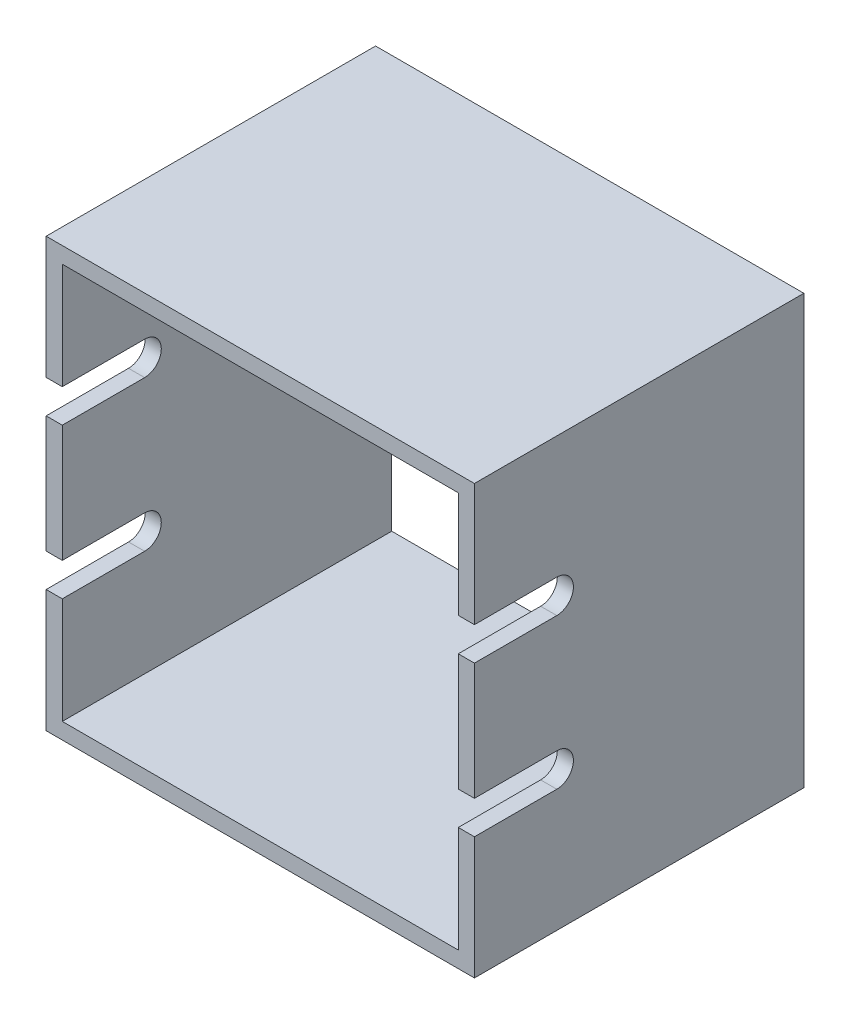
ISO-10303-21;
HEADER;
FILE_DESCRIPTION(('STEP AP214'),'2;1');
FILE_NAME('part.step','',(''),(''),'','','');
FILE_SCHEMA(('AUTOMOTIVE_DESIGN { 1 0 10303 214 1 1 1 1 }'));
ENDSEC;
DATA;
#1=APPLICATION_CONTEXT('core data for automotive mechanical design processes');
#2=APPLICATION_PROTOCOL_DEFINITION('international standard','automotive_design',2000,#1);
#3=PRODUCT_CONTEXT('',#1,'mechanical');
#4=PRODUCT('Part','Part','',(#3));
#5=PRODUCT_RELATED_PRODUCT_CATEGORY('part','',(#4));
#6=PRODUCT_DEFINITION_FORMATION('','',#4);
#7=PRODUCT_DEFINITION_CONTEXT('part definition',#1,'design');
#8=PRODUCT_DEFINITION('design','',#6,#7);
#9=PRODUCT_DEFINITION_SHAPE('','',#8);
#10=(LENGTH_UNIT() NAMED_UNIT(*) SI_UNIT(.MILLI.,.METRE.));
#11=(NAMED_UNIT(*) PLANE_ANGLE_UNIT() SI_UNIT($,.RADIAN.));
#12=(NAMED_UNIT(*) SI_UNIT($,.STERADIAN.) SOLID_ANGLE_UNIT());
#13=UNCERTAINTY_MEASURE_WITH_UNIT(LENGTH_MEASURE(1.E-05),#10,'distance_accuracy_value','');
#14=(GEOMETRIC_REPRESENTATION_CONTEXT(3) GLOBAL_UNCERTAINTY_ASSIGNED_CONTEXT((#13)) GLOBAL_UNIT_ASSIGNED_CONTEXT((#10,
#11,#12)) REPRESENTATION_CONTEXT('',''));
#15=CARTESIAN_POINT('',(0.,0.,0.));
#16=DIRECTION('',(0.,0.,1.));
#17=DIRECTION('',(1.,0.,0.));
#18=AXIS2_PLACEMENT_3D('',#15,#16,#17);
#19=CARTESIAN_POINT('',(-65.,-65.,100.));
#20=DIRECTION('',(1.,0.,0.));
#21=DIRECTION('',(0.,0.,-1.));
#22=AXIS2_PLACEMENT_3D('',#19,#20,#21);
#23=PLANE('',#22);
#24=CARTESIAN_POINT('',(-65.,22.825,75.));
#25=DIRECTION('',(-1.,0.,0.));
#26=DIRECTION('',(0.,0.,1.));
#27=AXIS2_PLACEMENT_3D('',#24,#25,#26);
#28=CIRCLE('',#27,5.05);
#29=CARTESIAN_POINT('',(-65.,27.875,75.));
#30=VERTEX_POINT('',#29);
#31=CARTESIAN_POINT('',(-65.,17.775,75.));
#32=VERTEX_POINT('',#31);
#33=EDGE_CURVE('E206',#30,#32,#28,.T.);
#34=ORIENTED_EDGE('',*,*,#33,.F.);
#35=DIRECTION('',(0.,0.,-1.));
#36=VECTOR('',#35,1.);
#37=CARTESIAN_POINT('',(-65.,27.875,0.));
#38=LINE('',#37,#36);
#39=CARTESIAN_POINT('',(-65.,27.875,100.));
#40=VERTEX_POINT('',#39);
#41=EDGE_CURVE('E214',#40,#30,#38,.T.);
#42=ORIENTED_EDGE('',*,*,#41,.F.);
#43=DIRECTION('',(0.,-1.,0.));
#44=VECTOR('',#43,1.);
#45=CARTESIAN_POINT('',(-65.,-65.,100.));
#46=LINE('',#45,#44);
#47=CARTESIAN_POINT('',(-65.,65.,100.));
#48=VERTEX_POINT('',#47);
#49=EDGE_CURVE('E317',#48,#40,#46,.T.);
#50=ORIENTED_EDGE('',*,*,#49,.F.);
#51=DIRECTION('',(0.,0.,-1.));
#52=VECTOR('',#51,1.);
#53=CARTESIAN_POINT('',(-65.,65.,100.));
#54=LINE('',#53,#52);
#55=CARTESIAN_POINT('',(-65.,65.,0.));
#56=VERTEX_POINT('',#55);
#57=EDGE_CURVE('E343',#48,#56,#54,.T.);
#58=ORIENTED_EDGE('',*,*,#57,.T.);
#59=DIRECTION('',(0.,-1.,0.));
#60=VECTOR('',#59,1.);
#61=CARTESIAN_POINT('',(-65.,-65.,0.));
#62=LINE('',#61,#60);
#63=CARTESIAN_POINT('',(-65.,-65.,0.));
#64=VERTEX_POINT('',#63);
#65=EDGE_CURVE('E330',#56,#64,#62,.T.);
#66=ORIENTED_EDGE('',*,*,#65,.T.);
#67=DIRECTION('',(0.,0.,-1.));
#68=VECTOR('',#67,1.);
#69=CARTESIAN_POINT('',(-65.,-65.,100.));
#70=LINE('',#69,#68);
#71=CARTESIAN_POINT('',(-65.,-65.,100.));
#72=VERTEX_POINT('',#71);
#73=EDGE_CURVE('E340',#72,#64,#70,.T.);
#74=ORIENTED_EDGE('',*,*,#73,.F.);
#75=CARTESIAN_POINT('',(-65.,-27.875,100.));
#76=VERTEX_POINT('',#75);
#77=EDGE_CURVE('E315',#76,#72,#46,.T.);
#78=ORIENTED_EDGE('',*,*,#77,.F.);
#79=DIRECTION('',(0.,0.,-1.));
#80=VECTOR('',#79,1.);
#81=CARTESIAN_POINT('',(-65.,-27.875,0.));
#82=LINE('',#81,#80);
#83=CARTESIAN_POINT('',(-65.,-27.875,75.));
#84=VERTEX_POINT('',#83);
#85=EDGE_CURVE('E241',#76,#84,#82,.T.);
#86=ORIENTED_EDGE('',*,*,#85,.T.);
#87=CARTESIAN_POINT('',(-65.,-22.825,75.));
#88=DIRECTION('',(-1.,0.,0.));
#89=DIRECTION('',(0.,0.,1.));
#90=AXIS2_PLACEMENT_3D('',#87,#88,#89);
#91=CIRCLE('',#90,5.05);
#92=CARTESIAN_POINT('',(-65.,-17.775,75.));
#93=VERTEX_POINT('',#92);
#94=EDGE_CURVE('E238',#84,#93,#91,.F.);
#95=ORIENTED_EDGE('',*,*,#94,.T.);
#96=DIRECTION('',(0.,0.,-1.));
#97=VECTOR('',#96,1.);
#98=CARTESIAN_POINT('',(-65.,-17.775,0.));
#99=LINE('',#98,#97);
#100=CARTESIAN_POINT('',(-65.,-17.775,100.));
#101=VERTEX_POINT('',#100);
#102=EDGE_CURVE('E235',#101,#93,#99,.T.);
#103=ORIENTED_EDGE('',*,*,#102,.F.);
#104=CARTESIAN_POINT('',(-65.,17.775,100.));
#105=VERTEX_POINT('',#104);
#106=EDGE_CURVE('E320',#105,#101,#46,.T.);
#107=ORIENTED_EDGE('',*,*,#106,.F.);
#108=DIRECTION('',(0.,0.,-1.));
#109=VECTOR('',#108,1.);
#110=CARTESIAN_POINT('',(-65.,17.775,0.));
#111=LINE('',#110,#109);
#112=EDGE_CURVE('E211',#105,#32,#111,.T.);
#113=ORIENTED_EDGE('',*,*,#112,.T.);
#114=EDGE_LOOP('',(#34,#42,#50,#58,#66,#74,#78,#86,#95,#103,#107,#113));
#115=FACE_BOUND('',#114,.T.);
#116=ADVANCED_FACE('F41',(#115),#23,.F.);
#117=CARTESIAN_POINT('',(65.,-65.,100.));
#118=DIRECTION('',(-1.,0.,0.));
#119=DIRECTION('',(0.,0.,1.));
#120=AXIS2_PLACEMENT_3D('',#117,#118,#119);
#121=PLANE('',#120);
#122=DIRECTION('',(0.,1.,0.));
#123=VECTOR('',#122,1.);
#124=CARTESIAN_POINT('',(65.,-65.,100.));
#125=LINE('',#124,#123);
#126=CARTESIAN_POINT('',(64.9999999999999,27.875,100.));
#127=VERTEX_POINT('',#126);
#128=CARTESIAN_POINT('',(65.,65.,100.));
#129=VERTEX_POINT('',#128);
#130=EDGE_CURVE('E322',#127,#129,#125,.T.);
#131=ORIENTED_EDGE('',*,*,#130,.F.);
#132=DIRECTION('',(0.,0.,-1.));
#133=VECTOR('',#132,1.);
#134=CARTESIAN_POINT('',(65.,27.875,100.));
#135=LINE('',#134,#133);
#136=CARTESIAN_POINT('',(64.9999999999999,27.875,75.));
#137=VERTEX_POINT('',#136);
#138=EDGE_CURVE('E282',#127,#137,#135,.T.);
#139=ORIENTED_EDGE('',*,*,#138,.T.);
#140=CARTESIAN_POINT('',(64.9999999999999,22.825,75.));
#141=DIRECTION('',(-1.,0.,0.));
#142=DIRECTION('',(0.,0.,1.));
#143=AXIS2_PLACEMENT_3D('',#140,#141,#142);
#144=CIRCLE('',#143,5.05);
#145=CARTESIAN_POINT('',(64.9999999999999,17.775,75.));
#146=VERTEX_POINT('',#145);
#147=EDGE_CURVE('E272',#137,#146,#144,.T.);
#148=ORIENTED_EDGE('',*,*,#147,.T.);
#149=DIRECTION('',(0.,0.,-1.));
#150=VECTOR('',#149,1.);
#151=CARTESIAN_POINT('',(65.,17.775,100.));
#152=LINE('',#151,#150);
#153=CARTESIAN_POINT('',(64.9999999999999,17.775,100.));
#154=VERTEX_POINT('',#153);
#155=EDGE_CURVE('E277',#154,#146,#152,.T.);
#156=ORIENTED_EDGE('',*,*,#155,.F.);
#157=CARTESIAN_POINT('',(64.9999999999999,-17.775,100.));
#158=VERTEX_POINT('',#157);
#159=EDGE_CURVE('E327',#158,#154,#125,.T.);
#160=ORIENTED_EDGE('',*,*,#159,.F.);
#161=DIRECTION('',(0.,0.,-1.));
#162=VECTOR('',#161,1.);
#163=CARTESIAN_POINT('',(65.,-17.775,100.));
#164=LINE('',#163,#162);
#165=CARTESIAN_POINT('',(64.9999999999999,-17.775,75.));
#166=VERTEX_POINT('',#165);
#167=EDGE_CURVE('E266',#158,#166,#164,.T.);
#168=ORIENTED_EDGE('',*,*,#167,.T.);
#169=CARTESIAN_POINT('',(64.9999999999999,-22.825,75.));
#170=DIRECTION('',(-1.,0.,0.));
#171=DIRECTION('',(0.,0.,1.));
#172=AXIS2_PLACEMENT_3D('',#169,#170,#171);
#173=CIRCLE('',#172,5.05);
#174=CARTESIAN_POINT('',(64.9999999999999,-27.875,75.));
#175=VERTEX_POINT('',#174);
#176=EDGE_CURVE('E257',#175,#166,#173,.F.);
#177=ORIENTED_EDGE('',*,*,#176,.F.);
#178=DIRECTION('',(0.,0.,-1.));
#179=VECTOR('',#178,1.);
#180=CARTESIAN_POINT('',(65.,-27.875,100.));
#181=LINE('',#180,#179);
#182=CARTESIAN_POINT('',(64.9999999999999,-27.875,100.));
#183=VERTEX_POINT('',#182);
#184=EDGE_CURVE('E261',#183,#175,#181,.T.);
#185=ORIENTED_EDGE('',*,*,#184,.F.);
#186=CARTESIAN_POINT('',(65.,-65.,100.));
#187=VERTEX_POINT('',#186);
#188=EDGE_CURVE('E323',#187,#183,#125,.T.);
#189=ORIENTED_EDGE('',*,*,#188,.F.);
#190=DIRECTION('',(0.,0.,-1.));
#191=VECTOR('',#190,1.);
#192=CARTESIAN_POINT('',(65.,-65.,100.));
#193=LINE('',#192,#191);
#194=CARTESIAN_POINT('',(65.,-65.,0.));
#195=VERTEX_POINT('',#194);
#196=EDGE_CURVE('E337',#187,#195,#193,.T.);
#197=ORIENTED_EDGE('',*,*,#196,.T.);
#198=DIRECTION('',(0.,1.,0.));
#199=VECTOR('',#198,1.);
#200=CARTESIAN_POINT('',(65.,-65.,0.));
#201=LINE('',#200,#199);
#202=CARTESIAN_POINT('',(65.,65.,0.));
#203=VERTEX_POINT('',#202);
#204=EDGE_CURVE('E316',#195,#203,#201,.T.);
#205=ORIENTED_EDGE('',*,*,#204,.T.);
#206=DIRECTION('',(0.,0.,-1.));
#207=VECTOR('',#206,1.);
#208=CARTESIAN_POINT('',(65.,65.,100.));
#209=LINE('',#208,#207);
#210=EDGE_CURVE('E326',#129,#203,#209,.T.);
#211=ORIENTED_EDGE('',*,*,#210,.F.);
#212=EDGE_LOOP('',(#131,#139,#148,#156,#160,#168,#177,#185,#189,#197,#205,#211));
#213=FACE_BOUND('',#212,.T.);
#214=ADVANCED_FACE('F392',(#213),#121,.F.);
#215=CARTESIAN_POINT('',(0.,0.,100.));
#216=DIRECTION('',(0.,0.,-1.));
#217=DIRECTION('',(-1.,0.,0.));
#218=AXIS2_PLACEMENT_3D('',#215,#216,#217);
#219=PLANE('',#218);
#220=DIRECTION('',(-1.,0.,0.));
#221=VECTOR('',#220,1.);
#222=CARTESIAN_POINT('',(935.,17.775,100.));
#223=LINE('',#222,#221);
#224=CARTESIAN_POINT('',(-60.1,17.775,100.));
#225=VERTEX_POINT('',#224);
#226=EDGE_CURVE('E229',#225,#105,#223,.T.);
#227=ORIENTED_EDGE('',*,*,#226,.T.);
#228=ORIENTED_EDGE('',*,*,#106,.T.);
#229=DIRECTION('',(-1.,0.,0.));
#230=VECTOR('',#229,1.);
#231=CARTESIAN_POINT('',(935.,-17.775,100.));
#232=LINE('',#231,#230);
#233=CARTESIAN_POINT('',(-60.1,-17.775,100.));
#234=VERTEX_POINT('',#233);
#235=EDGE_CURVE('E245',#234,#101,#232,.T.);
#236=ORIENTED_EDGE('',*,*,#235,.F.);
#237=DIRECTION('',(0.,-1.,0.));
#238=VECTOR('',#237,1.);
#239=CARTESIAN_POINT('',(-60.1,-60.1,100.));
#240=LINE('',#239,#238);
#241=EDGE_CURVE('E298',#225,#234,#240,.T.);
#242=ORIENTED_EDGE('',*,*,#241,.F.);
#243=EDGE_LOOP('',(#227,#228,#236,#242));
#244=FACE_BOUND('',#243,.T.);
#245=ADVANCED_FACE('F404',(#244),#219,.F.);
#246=CARTESIAN_POINT('',(60.1,17.775,100.));
#247=VERTEX_POINT('',#246);
#248=EDGE_CURVE('E228',#154,#247,#223,.T.);
#249=ORIENTED_EDGE('',*,*,#248,.T.);
#250=DIRECTION('',(0.,1.,0.));
#251=VECTOR('',#250,1.);
#252=CARTESIAN_POINT('',(60.1,-60.1,100.));
#253=LINE('',#252,#251);
#254=CARTESIAN_POINT('',(60.1,-17.775,100.));
#255=VERTEX_POINT('',#254);
#256=EDGE_CURVE('E290',#255,#247,#253,.T.);
#257=ORIENTED_EDGE('',*,*,#256,.F.);
#258=EDGE_CURVE('E220',#158,#255,#232,.T.);
#259=ORIENTED_EDGE('',*,*,#258,.F.);
#260=ORIENTED_EDGE('',*,*,#159,.T.);
#261=EDGE_LOOP('',(#249,#257,#259,#260));
#262=FACE_BOUND('',#261,.T.);
#263=ADVANCED_FACE('F437',(#262),#219,.F.);
#264=DIRECTION('',(-1.,0.,0.));
#265=VECTOR('',#264,1.);
#266=CARTESIAN_POINT('',(935.,-27.875,100.));
#267=LINE('',#266,#265);
#268=CARTESIAN_POINT('',(-60.1,-27.875,100.));
#269=VERTEX_POINT('',#268);
#270=EDGE_CURVE('E248',#269,#76,#267,.T.);
#271=ORIENTED_EDGE('',*,*,#270,.T.);
#272=ORIENTED_EDGE('',*,*,#77,.T.);
#273=DIRECTION('',(1.,0.,0.));
#274=VECTOR('',#273,1.);
#275=CARTESIAN_POINT('',(65.,-65.,100.));
#276=LINE('',#275,#274);
#277=EDGE_CURVE('E319',#72,#187,#276,.T.);
#278=ORIENTED_EDGE('',*,*,#277,.T.);
#279=ORIENTED_EDGE('',*,*,#188,.T.);
#280=CARTESIAN_POINT('',(60.1,-27.875,100.));
#281=VERTEX_POINT('',#280);
#282=EDGE_CURVE('E247',#183,#281,#267,.T.);
#283=ORIENTED_EDGE('',*,*,#282,.T.);
#284=CARTESIAN_POINT('',(60.1,-60.1,100.));
#285=VERTEX_POINT('',#284);
#286=EDGE_CURVE('E286',#285,#281,#253,.T.);
#287=ORIENTED_EDGE('',*,*,#286,.F.);
#288=DIRECTION('',(1.,0.,0.));
#289=VECTOR('',#288,1.);
#290=CARTESIAN_POINT('',(-60.1,-60.1,100.));
#291=LINE('',#290,#289);
#292=CARTESIAN_POINT('',(-60.1,-60.1,100.));
#293=VERTEX_POINT('',#292);
#294=EDGE_CURVE('E297',#293,#285,#291,.T.);
#295=ORIENTED_EDGE('',*,*,#294,.F.);
#296=EDGE_CURVE('E293',#269,#293,#240,.T.);
#297=ORIENTED_EDGE('',*,*,#296,.F.);
#298=EDGE_LOOP('',(#271,#272,#278,#279,#283,#287,#295,#297));
#299=FACE_BOUND('',#298,.T.);
#300=ADVANCED_FACE('F397',(#299),#219,.F.);
#301=CARTESIAN_POINT('',(60.1,-60.1,-900.));
#302=DIRECTION('',(1.,0.,0.));
#303=DIRECTION('',(0.,0.,-1.));
#304=AXIS2_PLACEMENT_3D('',#301,#302,#303);
#305=PLANE('',#304);
#306=CARTESIAN_POINT('',(60.1,22.825,75.));
#307=DIRECTION('',(1.,0.,0.));
#308=DIRECTION('',(0.,0.,-1.));
#309=AXIS2_PLACEMENT_3D('',#306,#307,#308);
#310=CIRCLE('',#309,5.05);
#311=CARTESIAN_POINT('',(60.1,17.775,75.));
#312=VERTEX_POINT('',#311);
#313=CARTESIAN_POINT('',(60.1,27.875,75.));
#314=VERTEX_POINT('',#313);
#315=EDGE_CURVE('E269',#312,#314,#310,.T.);
#316=ORIENTED_EDGE('',*,*,#315,.T.);
#317=DIRECTION('',(0.,0.,1.));
#318=VECTOR('',#317,1.);
#319=CARTESIAN_POINT('',(60.1,27.8749999999999,-900.));
#320=LINE('',#319,#318);
#321=CARTESIAN_POINT('',(60.1,27.875,100.));
#322=VERTEX_POINT('',#321);
#323=EDGE_CURVE('E279',#314,#322,#320,.T.);
#324=ORIENTED_EDGE('',*,*,#323,.T.);
#325=CARTESIAN_POINT('',(60.1,60.1,100.));
#326=VERTEX_POINT('',#325);
#327=EDGE_CURVE('E285',#322,#326,#253,.T.);
#328=ORIENTED_EDGE('',*,*,#327,.T.);
#329=DIRECTION('',(0.,0.,1.));
#330=VECTOR('',#329,1.);
#331=CARTESIAN_POINT('',(60.1,60.1,-900.));
#332=LINE('',#331,#330);
#333=CARTESIAN_POINT('',(60.1,60.1,0.));
#334=VERTEX_POINT('',#333);
#335=EDGE_CURVE('E301',#334,#326,#332,.T.);
#336=ORIENTED_EDGE('',*,*,#335,.F.);
#337=DIRECTION('',(0.,-1.,0.));
#338=VECTOR('',#337,1.);
#339=CARTESIAN_POINT('',(60.1,0.,0.));
#340=LINE('',#339,#338);
#341=CARTESIAN_POINT('',(60.1,-60.1,0.));
#342=VERTEX_POINT('',#341);
#343=EDGE_CURVE('E353',#334,#342,#340,.T.);
#344=ORIENTED_EDGE('',*,*,#343,.T.);
#345=DIRECTION('',(0.,0.,1.));
#346=VECTOR('',#345,1.);
#347=CARTESIAN_POINT('',(60.1,-60.1,-900.));
#348=LINE('',#347,#346);
#349=EDGE_CURVE('E302',#342,#285,#348,.T.);
#350=ORIENTED_EDGE('',*,*,#349,.T.);
#351=ORIENTED_EDGE('',*,*,#286,.T.);
#352=DIRECTION('',(0.,0.,1.));
#353=VECTOR('',#352,1.);
#354=CARTESIAN_POINT('',(60.1,-27.8749999999999,-900.));
#355=LINE('',#354,#353);
#356=CARTESIAN_POINT('',(60.1,-27.875,75.));
#357=VERTEX_POINT('',#356);
#358=EDGE_CURVE('E259',#357,#281,#355,.T.);
#359=ORIENTED_EDGE('',*,*,#358,.F.);
#360=CARTESIAN_POINT('',(60.1,-22.825,75.));
#361=DIRECTION('',(1.,0.,0.));
#362=DIRECTION('',(0.,0.,-1.));
#363=AXIS2_PLACEMENT_3D('',#360,#361,#362);
#364=CIRCLE('',#363,5.05);
#365=CARTESIAN_POINT('',(60.1,-17.775,75.));
#366=VERTEX_POINT('',#365);
#367=EDGE_CURVE('E255',#366,#357,#364,.F.);
#368=ORIENTED_EDGE('',*,*,#367,.F.);
#369=DIRECTION('',(0.,0.,1.));
#370=VECTOR('',#369,1.);
#371=CARTESIAN_POINT('',(60.1,-17.7749999999999,-900.));
#372=LINE('',#371,#370);
#373=EDGE_CURVE('E263',#366,#255,#372,.T.);
#374=ORIENTED_EDGE('',*,*,#373,.T.);
#375=ORIENTED_EDGE('',*,*,#256,.T.);
#376=DIRECTION('',(0.,0.,1.));
#377=VECTOR('',#376,1.);
#378=CARTESIAN_POINT('',(60.1,17.7749999999999,-900.));
#379=LINE('',#378,#377);
#380=EDGE_CURVE('E275',#312,#247,#379,.T.);
#381=ORIENTED_EDGE('',*,*,#380,.F.);
#382=EDGE_LOOP('',(#316,#324,#328,#336,#344,#350,#351,#359,#368,#374,#375,#381));
#383=FACE_BOUND('',#382,.T.);
#384=ADVANCED_FACE('F421',(#383),#305,.F.);
#385=CARTESIAN_POINT('',(-60.1,-60.1,-900.));
#386=DIRECTION('',(-1.,0.,0.));
#387=DIRECTION('',(0.,0.,1.));
#388=AXIS2_PLACEMENT_3D('',#385,#386,#387);
#389=PLANE('',#388);
#390=CARTESIAN_POINT('',(-60.1,60.1,100.));
#391=VERTEX_POINT('',#390);
#392=CARTESIAN_POINT('',(-60.1,27.875,100.));
#393=VERTEX_POINT('',#392);
#394=EDGE_CURVE('E294',#391,#393,#240,.T.);
#395=ORIENTED_EDGE('',*,*,#394,.T.);
#396=DIRECTION('',(0.,0.,-1.));
#397=VECTOR('',#396,1.);
#398=CARTESIAN_POINT('',(-60.1,27.8749999999999,-900.));
#399=LINE('',#398,#397);
#400=CARTESIAN_POINT('',(-60.1,27.875,75.));
#401=VERTEX_POINT('',#400);
#402=EDGE_CURVE('E11',#393,#401,#399,.T.);
#403=ORIENTED_EDGE('',*,*,#402,.T.);
#404=CARTESIAN_POINT('',(-60.1,22.825,75.));
#405=DIRECTION('',(-1.,0.,0.));
#406=DIRECTION('',(0.,0.,1.));
#407=AXIS2_PLACEMENT_3D('',#404,#405,#406);
#408=CIRCLE('',#407,5.05);
#409=CARTESIAN_POINT('',(-60.1,17.775,75.));
#410=VERTEX_POINT('',#409);
#411=EDGE_CURVE('E209',#401,#410,#408,.T.);
#412=ORIENTED_EDGE('',*,*,#411,.T.);
#413=DIRECTION('',(0.,0.,-1.));
#414=VECTOR('',#413,1.);
#415=CARTESIAN_POINT('',(-60.1,17.7749999999999,-900.));
#416=LINE('',#415,#414);
#417=EDGE_CURVE('E49',#225,#410,#416,.T.);
#418=ORIENTED_EDGE('',*,*,#417,.F.);
#419=ORIENTED_EDGE('',*,*,#241,.T.);
#420=DIRECTION('',(0.,0.,-1.));
#421=VECTOR('',#420,1.);
#422=CARTESIAN_POINT('',(-60.1,-17.7749999999999,-900.));
#423=LINE('',#422,#421);
#424=CARTESIAN_POINT('',(-60.1,-17.775,75.));
#425=VERTEX_POINT('',#424);
#426=EDGE_CURVE('E360',#234,#425,#423,.T.);
#427=ORIENTED_EDGE('',*,*,#426,.T.);
#428=CARTESIAN_POINT('',(-60.1,-22.825,75.));
#429=DIRECTION('',(-1.,0.,0.));
#430=DIRECTION('',(0.,0.,1.));
#431=AXIS2_PLACEMENT_3D('',#428,#429,#430);
#432=CIRCLE('',#431,5.05);
#433=CARTESIAN_POINT('',(-60.1,-27.875,75.));
#434=VERTEX_POINT('',#433);
#435=EDGE_CURVE('E355',#434,#425,#432,.F.);
#436=ORIENTED_EDGE('',*,*,#435,.F.);
#437=DIRECTION('',(0.,0.,-1.));
#438=VECTOR('',#437,1.);
#439=CARTESIAN_POINT('',(-60.1,-27.8749999999999,-900.));
#440=LINE('',#439,#438);
#441=EDGE_CURVE('E357',#269,#434,#440,.T.);
#442=ORIENTED_EDGE('',*,*,#441,.F.);
#443=ORIENTED_EDGE('',*,*,#296,.T.);
#444=DIRECTION('',(0.,0.,1.));
#445=VECTOR('',#444,1.);
#446=CARTESIAN_POINT('',(-60.1,-60.1,-900.));
#447=LINE('',#446,#445);
#448=CARTESIAN_POINT('',(-60.1,-60.1,0.));
#449=VERTEX_POINT('',#448);
#450=EDGE_CURVE('E305',#449,#293,#447,.T.);
#451=ORIENTED_EDGE('',*,*,#450,.F.);
#452=DIRECTION('',(0.,1.,0.));
#453=VECTOR('',#452,1.);
#454=CARTESIAN_POINT('',(-60.1,0.,0.));
#455=LINE('',#454,#453);
#456=CARTESIAN_POINT('',(-60.1,60.1,0.));
#457=VERTEX_POINT('',#456);
#458=EDGE_CURVE('E348',#449,#457,#455,.T.);
#459=ORIENTED_EDGE('',*,*,#458,.T.);
#460=DIRECTION('',(0.,0.,1.));
#461=VECTOR('',#460,1.);
#462=CARTESIAN_POINT('',(-60.1,60.1,-900.));
#463=LINE('',#462,#461);
#464=EDGE_CURVE('E308',#457,#391,#463,.T.);
#465=ORIENTED_EDGE('',*,*,#464,.T.);
#466=EDGE_LOOP('',(#395,#403,#412,#418,#419,#427,#436,#442,#443,#451,#459,#465));
#467=FACE_BOUND('',#466,.T.);
#468=ADVANCED_FACE('F370',(#467),#389,.F.);
#469=CARTESIAN_POINT('',(65.,65.,100.));
#470=DIRECTION('',(0.,-1.,0.));
#471=DIRECTION('',(0.,0.,-1.));
#472=AXIS2_PLACEMENT_3D('',#469,#470,#471);
#473=PLANE('',#472);
#474=DIRECTION('',(-1.,0.,0.));
#475=VECTOR('',#474,1.);
#476=CARTESIAN_POINT('',(65.,65.,0.));
#477=LINE('',#476,#475);
#478=EDGE_CURVE('E304',#203,#56,#477,.T.);
#479=ORIENTED_EDGE('',*,*,#478,.T.);
#480=ORIENTED_EDGE('',*,*,#57,.F.);
#481=DIRECTION('',(-1.,0.,0.));
#482=VECTOR('',#481,1.);
#483=CARTESIAN_POINT('',(65.,65.,100.));
#484=LINE('',#483,#482);
#485=EDGE_CURVE('E312',#129,#48,#484,.T.);
#486=ORIENTED_EDGE('',*,*,#485,.F.);
#487=ORIENTED_EDGE('',*,*,#210,.T.);
#488=EDGE_LOOP('',(#479,#480,#486,#487));
#489=FACE_BOUND('',#488,.T.);
#490=ADVANCED_FACE('F43',(#489),#473,.F.);
#491=CARTESIAN_POINT('',(65.,-65.,100.));
#492=DIRECTION('',(0.,1.,0.));
#493=DIRECTION('',(0.,0.,1.));
#494=AXIS2_PLACEMENT_3D('',#491,#492,#493);
#495=PLANE('',#494);
#496=DIRECTION('',(1.,0.,0.));
#497=VECTOR('',#496,1.);
#498=CARTESIAN_POINT('',(65.,-65.,0.));
#499=LINE('',#498,#497);
#500=EDGE_CURVE('E332',#64,#195,#499,.T.);
#501=ORIENTED_EDGE('',*,*,#500,.T.);
#502=ORIENTED_EDGE('',*,*,#196,.F.);
#503=ORIENTED_EDGE('',*,*,#277,.F.);
#504=ORIENTED_EDGE('',*,*,#73,.T.);
#505=EDGE_LOOP('',(#501,#502,#503,#504));
#506=FACE_BOUND('',#505,.T.);
#507=ADVANCED_FACE('F387',(#506),#495,.F.);
#508=ORIENTED_EDGE('',*,*,#49,.T.);
#509=DIRECTION('',(-1.,0.,0.));
#510=VECTOR('',#509,1.);
#511=CARTESIAN_POINT('',(935.,27.875,100.));
#512=LINE('',#511,#510);
#513=EDGE_CURVE('E217',#393,#40,#512,.T.);
#514=ORIENTED_EDGE('',*,*,#513,.F.);
#515=ORIENTED_EDGE('',*,*,#394,.F.);
#516=DIRECTION('',(-1.,0.,0.));
#517=VECTOR('',#516,1.);
#518=CARTESIAN_POINT('',(-60.1,60.1,100.));
#519=LINE('',#518,#517);
#520=EDGE_CURVE('E289',#326,#391,#519,.T.);
#521=ORIENTED_EDGE('',*,*,#520,.F.);
#522=ORIENTED_EDGE('',*,*,#327,.F.);
#523=EDGE_CURVE('E227',#127,#322,#512,.T.);
#524=ORIENTED_EDGE('',*,*,#523,.F.);
#525=ORIENTED_EDGE('',*,*,#130,.T.);
#526=ORIENTED_EDGE('',*,*,#485,.T.);
#527=EDGE_LOOP('',(#508,#514,#515,#521,#522,#524,#525,#526));
#528=FACE_BOUND('',#527,.T.);
#529=ADVANCED_FACE('F373',(#528),#219,.F.);
#530=CARTESIAN_POINT('',(0.,0.,0.));
#531=DIRECTION('',(0.,0.,-1.));
#532=DIRECTION('',(-1.,0.,0.));
#533=AXIS2_PLACEMENT_3D('',#530,#531,#532);
#534=PLANE('',#533);
#535=ORIENTED_EDGE('',*,*,#343,.F.);
#536=DIRECTION('',(1.,0.,0.));
#537=VECTOR('',#536,1.);
#538=CARTESIAN_POINT('',(0.,60.1,0.));
#539=LINE('',#538,#537);
#540=EDGE_CURVE('E346',#457,#334,#539,.T.);
#541=ORIENTED_EDGE('',*,*,#540,.F.);
#542=ORIENTED_EDGE('',*,*,#458,.F.);
#543=DIRECTION('',(-1.,0.,0.));
#544=VECTOR('',#543,1.);
#545=CARTESIAN_POINT('',(0.,-60.1,0.));
#546=LINE('',#545,#544);
#547=EDGE_CURVE('E351',#342,#449,#546,.T.);
#548=ORIENTED_EDGE('',*,*,#547,.F.);
#549=EDGE_LOOP('',(#535,#541,#542,#548));
#550=FACE_BOUND('',#549,.T.);
#551=ORIENTED_EDGE('',*,*,#478,.F.);
#552=ORIENTED_EDGE('',*,*,#204,.F.);
#553=ORIENTED_EDGE('',*,*,#500,.F.);
#554=ORIENTED_EDGE('',*,*,#65,.F.);
#555=EDGE_LOOP('',(#551,#552,#553,#554));
#556=FACE_BOUND('',#555,.T.);
#557=ADVANCED_FACE('F383',(#550,#556),#534,.T.);
#558=CARTESIAN_POINT('',(-60.1,-60.1,-900.));
#559=DIRECTION('',(0.,-1.,0.));
#560=DIRECTION('',(0.,0.,-1.));
#561=AXIS2_PLACEMENT_3D('',#558,#559,#560);
#562=PLANE('',#561);
#563=ORIENTED_EDGE('',*,*,#547,.T.);
#564=ORIENTED_EDGE('',*,*,#450,.T.);
#565=ORIENTED_EDGE('',*,*,#294,.T.);
#566=ORIENTED_EDGE('',*,*,#349,.F.);
#567=EDGE_LOOP('',(#563,#564,#565,#566));
#568=FACE_BOUND('',#567,.T.);
#569=ADVANCED_FACE('F416',(#568),#562,.F.);
#570=CARTESIAN_POINT('',(-60.1,60.1,-900.));
#571=DIRECTION('',(0.,1.,0.));
#572=DIRECTION('',(0.,0.,1.));
#573=AXIS2_PLACEMENT_3D('',#570,#571,#572);
#574=PLANE('',#573);
#575=ORIENTED_EDGE('',*,*,#540,.T.);
#576=ORIENTED_EDGE('',*,*,#335,.T.);
#577=ORIENTED_EDGE('',*,*,#520,.T.);
#578=ORIENTED_EDGE('',*,*,#464,.F.);
#579=EDGE_LOOP('',(#575,#576,#577,#578));
#580=FACE_BOUND('',#579,.T.);
#581=ADVANCED_FACE('F428',(#580),#574,.F.);
#582=CARTESIAN_POINT('',(935.,-22.825,75.));
#583=DIRECTION('',(-1.,0.,0.));
#584=DIRECTION('',(0.,0.,1.));
#585=AXIS2_PLACEMENT_3D('',#582,#583,#584);
#586=CYLINDRICAL_SURFACE('',#585,5.05);
#587=ORIENTED_EDGE('',*,*,#435,.T.);
#588=DIRECTION('',(-1.,0.,0.));
#589=VECTOR('',#588,1.);
#590=CARTESIAN_POINT('',(935.,-17.775,75.));
#591=LINE('',#590,#589);
#592=EDGE_CURVE('E244',#425,#93,#591,.T.);
#593=ORIENTED_EDGE('',*,*,#592,.T.);
#594=ORIENTED_EDGE('',*,*,#94,.F.);
#595=DIRECTION('',(-1.,0.,0.));
#596=VECTOR('',#595,1.);
#597=CARTESIAN_POINT('',(935.,-27.875,75.));
#598=LINE('',#597,#596);
#599=EDGE_CURVE('E252',#434,#84,#598,.T.);
#600=ORIENTED_EDGE('',*,*,#599,.F.);
#601=EDGE_LOOP('',(#587,#593,#594,#600));
#602=FACE_BOUND('',#601,.T.);
#603=ADVANCED_FACE('F458',(#602),#586,.F.);
#604=CARTESIAN_POINT('',(935.,-27.875,0.));
#605=DIRECTION('',(0.,1.,0.));
#606=DIRECTION('',(0.,0.,1.));
#607=AXIS2_PLACEMENT_3D('',#604,#605,#606);
#608=PLANE('',#607);
#609=ORIENTED_EDGE('',*,*,#441,.T.);
#610=ORIENTED_EDGE('',*,*,#599,.T.);
#611=ORIENTED_EDGE('',*,*,#85,.F.);
#612=ORIENTED_EDGE('',*,*,#270,.F.);
#613=EDGE_LOOP('',(#609,#610,#611,#612));
#614=FACE_BOUND('',#613,.T.);
#615=ADVANCED_FACE('F487',(#614),#608,.T.);
#616=CARTESIAN_POINT('',(935.,-17.775,0.));
#617=DIRECTION('',(0.,1.,0.));
#618=DIRECTION('',(0.,0.,1.));
#619=AXIS2_PLACEMENT_3D('',#616,#617,#618);
#620=PLANE('',#619);
#621=ORIENTED_EDGE('',*,*,#235,.T.);
#622=ORIENTED_EDGE('',*,*,#102,.T.);
#623=ORIENTED_EDGE('',*,*,#592,.F.);
#624=ORIENTED_EDGE('',*,*,#426,.F.);
#625=EDGE_LOOP('',(#621,#622,#623,#624));
#626=FACE_BOUND('',#625,.T.);
#627=ADVANCED_FACE('F409',(#626),#620,.F.);
#628=CARTESIAN_POINT('',(935.,22.825,75.));
#629=DIRECTION('',(-1.,0.,0.));
#630=DIRECTION('',(0.,0.,1.));
#631=AXIS2_PLACEMENT_3D('',#628,#629,#630);
#632=CYLINDRICAL_SURFACE('',#631,5.05);
#633=DIRECTION('',(-1.,0.,0.));
#634=VECTOR('',#633,1.);
#635=CARTESIAN_POINT('',(935.,27.875,75.));
#636=LINE('',#635,#634);
#637=EDGE_CURVE('E202',#401,#30,#636,.T.);
#638=ORIENTED_EDGE('',*,*,#637,.T.);
#639=ORIENTED_EDGE('',*,*,#33,.T.);
#640=DIRECTION('',(-1.,0.,0.));
#641=VECTOR('',#640,1.);
#642=CARTESIAN_POINT('',(935.,17.775,75.));
#643=LINE('',#642,#641);
#644=EDGE_CURVE('E233',#410,#32,#643,.T.);
#645=ORIENTED_EDGE('',*,*,#644,.F.);
#646=ORIENTED_EDGE('',*,*,#411,.F.);
#647=EDGE_LOOP('',(#638,#639,#645,#646));
#648=FACE_BOUND('',#647,.T.);
#649=ADVANCED_FACE('F204',(#648),#632,.F.);
#650=CARTESIAN_POINT('',(935.,17.775,0.));
#651=DIRECTION('',(0.,1.,0.));
#652=DIRECTION('',(0.,0.,1.));
#653=AXIS2_PLACEMENT_3D('',#650,#651,#652);
#654=PLANE('',#653);
#655=ORIENTED_EDGE('',*,*,#417,.T.);
#656=ORIENTED_EDGE('',*,*,#644,.T.);
#657=ORIENTED_EDGE('',*,*,#112,.F.);
#658=ORIENTED_EDGE('',*,*,#226,.F.);
#659=EDGE_LOOP('',(#655,#656,#657,#658));
#660=FACE_BOUND('',#659,.T.);
#661=ADVANCED_FACE('F366',(#660),#654,.T.);
#662=CARTESIAN_POINT('',(935.,27.875,0.));
#663=DIRECTION('',(0.,1.,0.));
#664=DIRECTION('',(0.,0.,1.));
#665=AXIS2_PLACEMENT_3D('',#662,#663,#664);
#666=PLANE('',#665);
#667=ORIENTED_EDGE('',*,*,#513,.T.);
#668=ORIENTED_EDGE('',*,*,#41,.T.);
#669=ORIENTED_EDGE('',*,*,#637,.F.);
#670=ORIENTED_EDGE('',*,*,#402,.F.);
#671=EDGE_LOOP('',(#667,#668,#669,#670));
#672=FACE_BOUND('',#671,.T.);
#673=ADVANCED_FACE('F215',(#672),#666,.F.);
#674=ORIENTED_EDGE('',*,*,#258,.T.);
#675=ORIENTED_EDGE('',*,*,#373,.F.);
#676=EDGE_CURVE('E64',#166,#366,#591,.T.);
#677=ORIENTED_EDGE('',*,*,#676,.F.);
#678=ORIENTED_EDGE('',*,*,#167,.F.);
#679=EDGE_LOOP('',(#674,#675,#677,#678));
#680=FACE_BOUND('',#679,.T.);
#681=ADVANCED_FACE('F462',(#680),#620,.F.);
#682=ORIENTED_EDGE('',*,*,#184,.T.);
#683=EDGE_CURVE('E251',#175,#357,#598,.T.);
#684=ORIENTED_EDGE('',*,*,#683,.T.);
#685=ORIENTED_EDGE('',*,*,#358,.T.);
#686=ORIENTED_EDGE('',*,*,#282,.F.);
#687=EDGE_LOOP('',(#682,#684,#685,#686));
#688=FACE_BOUND('',#687,.T.);
#689=ADVANCED_FACE('F456',(#688),#608,.T.);
#690=ORIENTED_EDGE('',*,*,#176,.T.);
#691=ORIENTED_EDGE('',*,*,#676,.T.);
#692=ORIENTED_EDGE('',*,*,#367,.T.);
#693=ORIENTED_EDGE('',*,*,#683,.F.);
#694=EDGE_LOOP('',(#690,#691,#692,#693));
#695=FACE_BOUND('',#694,.T.);
#696=ADVANCED_FACE('F449',(#695),#586,.F.);
#697=ORIENTED_EDGE('',*,*,#523,.T.);
#698=ORIENTED_EDGE('',*,*,#323,.F.);
#699=EDGE_CURVE('E56',#137,#314,#636,.T.);
#700=ORIENTED_EDGE('',*,*,#699,.F.);
#701=ORIENTED_EDGE('',*,*,#138,.F.);
#702=EDGE_LOOP('',(#697,#698,#700,#701));
#703=FACE_BOUND('',#702,.T.);
#704=ADVANCED_FACE('F447',(#703),#666,.F.);
#705=ORIENTED_EDGE('',*,*,#155,.T.);
#706=EDGE_CURVE('E232',#146,#312,#643,.T.);
#707=ORIENTED_EDGE('',*,*,#706,.T.);
#708=ORIENTED_EDGE('',*,*,#380,.T.);
#709=ORIENTED_EDGE('',*,*,#248,.F.);
#710=EDGE_LOOP('',(#705,#707,#708,#709));
#711=FACE_BOUND('',#710,.T.);
#712=ADVANCED_FACE('F442',(#711),#654,.T.);
#713=ORIENTED_EDGE('',*,*,#699,.T.);
#714=ORIENTED_EDGE('',*,*,#315,.F.);
#715=ORIENTED_EDGE('',*,*,#706,.F.);
#716=ORIENTED_EDGE('',*,*,#147,.F.);
#717=EDGE_LOOP('',(#713,#714,#715,#716));
#718=FACE_BOUND('',#717,.T.);
#719=ADVANCED_FACE('F445',(#718),#632,.F.);
#720=CLOSED_SHELL('',(#116,#214,#245,#263,#300,#384,#468,#490,#507,#529,#557,#569,#581,#603,
#615,#627,#649,#661,#673,#681,#689,#696,#704,#712,#719));
#721=MANIFOLD_SOLID_BREP('B2',#720);
#722=ADVANCED_BREP_SHAPE_REPRESENTATION('',(#18,#721),#14);
#723=SHAPE_DEFINITION_REPRESENTATION(#9,#722);
ENDSEC;
END-ISO-10303-21;
